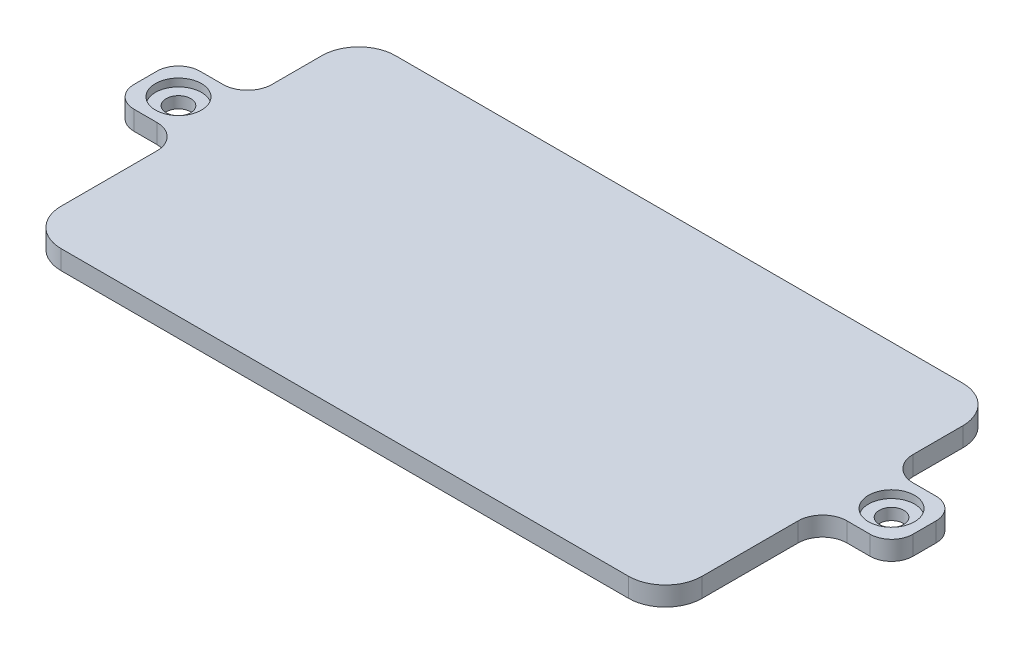
ISO-10303-21;
HEADER;
FILE_DESCRIPTION(('STEP AP214'),'2;1');
FILE_NAME('part.step','',(''),(''),'','','');
FILE_SCHEMA(('AUTOMOTIVE_DESIGN { 1 0 10303 214 1 1 1 1 }'));
ENDSEC;
DATA;
#1=APPLICATION_CONTEXT('core data for automotive mechanical design processes');
#2=APPLICATION_PROTOCOL_DEFINITION('international standard','automotive_design',2000,#1);
#3=PRODUCT_CONTEXT('',#1,'mechanical');
#4=PRODUCT('Part','Part','',(#3));
#5=PRODUCT_RELATED_PRODUCT_CATEGORY('part','',(#4));
#6=PRODUCT_DEFINITION_FORMATION('','',#4);
#7=PRODUCT_DEFINITION_CONTEXT('part definition',#1,'design');
#8=PRODUCT_DEFINITION('design','',#6,#7);
#9=PRODUCT_DEFINITION_SHAPE('','',#8);
#10=(LENGTH_UNIT() NAMED_UNIT(*) SI_UNIT(.MILLI.,.METRE.));
#11=(NAMED_UNIT(*) PLANE_ANGLE_UNIT() SI_UNIT($,.RADIAN.));
#12=(NAMED_UNIT(*) SI_UNIT($,.STERADIAN.) SOLID_ANGLE_UNIT());
#13=UNCERTAINTY_MEASURE_WITH_UNIT(LENGTH_MEASURE(1.E-05),#10,'distance_accuracy_value','');
#14=(GEOMETRIC_REPRESENTATION_CONTEXT(3) GLOBAL_UNCERTAINTY_ASSIGNED_CONTEXT((#13)) GLOBAL_UNIT_ASSIGNED_CONTEXT((#10,
#11,#12)) REPRESENTATION_CONTEXT('',''));
#15=CARTESIAN_POINT('',(0.,0.,0.));
#16=DIRECTION('',(0.,0.,1.));
#17=DIRECTION('',(1.,0.,0.));
#18=AXIS2_PLACEMENT_3D('',#15,#16,#17);
#19=CARTESIAN_POINT('',(109.635435749424,0.,-25.));
#20=DIRECTION('',(0.,1.,0.));
#21=DIRECTION('',(0.,0.,1.));
#22=AXIS2_PLACEMENT_3D('',#19,#20,#21);
#23=CYLINDRICAL_SURFACE('',#22,1.59999999999999);
#24=CARTESIAN_POINT('',(109.635435749424,0.,-25.));
#25=DIRECTION('',(0.,1.,0.));
#26=DIRECTION('',(0.,0.,1.));
#27=AXIS2_PLACEMENT_3D('',#24,#25,#26);
#28=CIRCLE('',#27,1.59999999999999);
#29=CARTESIAN_POINT('',(109.635435749424,0.,-23.4));
#30=VERTEX_POINT('',#29);
#31=EDGE_CURVE('E340',#30,#30,#28,.T.);
#32=ORIENTED_EDGE('',*,*,#31,.F.);
#33=EDGE_LOOP('',(#32));
#34=FACE_BOUND('',#33,.T.);
#35=CARTESIAN_POINT('',(109.635435749424,1.5,-25.));
#36=DIRECTION('',(0.,1.,0.));
#37=DIRECTION('',(0.,0.,1.));
#38=AXIS2_PLACEMENT_3D('',#35,#36,#37);
#39=CIRCLE('',#38,1.59999999999999);
#40=CARTESIAN_POINT('',(109.635435749424,1.5,-23.4));
#41=VERTEX_POINT('',#40);
#42=EDGE_CURVE('E37',#41,#41,#39,.F.);
#43=ORIENTED_EDGE('',*,*,#42,.F.);
#44=EDGE_LOOP('',(#43));
#45=FACE_BOUND('',#44,.T.);
#46=ADVANCED_FACE('F33',(#34,#45),#23,.F.);
#47=CARTESIAN_POINT('',(16.6354357494244,0.,-25.));
#48=DIRECTION('',(0.,1.,0.));
#49=DIRECTION('',(0.,0.,1.));
#50=AXIS2_PLACEMENT_3D('',#47,#48,#49);
#51=CYLINDRICAL_SURFACE('',#50,1.6);
#52=CARTESIAN_POINT('',(16.6354357494244,0.,-25.));
#53=DIRECTION('',(0.,1.,0.));
#54=DIRECTION('',(0.,0.,1.));
#55=AXIS2_PLACEMENT_3D('',#52,#53,#54);
#56=CIRCLE('',#55,1.6);
#57=CARTESIAN_POINT('',(16.6354357494244,0.,-23.4));
#58=VERTEX_POINT('',#57);
#59=EDGE_CURVE('E232',#58,#58,#56,.T.);
#60=ORIENTED_EDGE('',*,*,#59,.F.);
#61=EDGE_LOOP('',(#60));
#62=FACE_BOUND('',#61,.T.);
#63=CARTESIAN_POINT('',(16.6354357494244,1.5,-25.));
#64=DIRECTION('',(0.,1.,0.));
#65=DIRECTION('',(0.,0.,1.));
#66=AXIS2_PLACEMENT_3D('',#63,#64,#65);
#67=CIRCLE('',#66,1.6);
#68=CARTESIAN_POINT('',(16.6354357494244,1.5,-23.4));
#69=VERTEX_POINT('',#68);
#70=EDGE_CURVE('E334',#69,#69,#67,.F.);
#71=ORIENTED_EDGE('',*,*,#70,.F.);
#72=EDGE_LOOP('',(#71));
#73=FACE_BOUND('',#72,.T.);
#74=ADVANCED_FACE('F426',(#62,#73),#51,.F.);
#75=CARTESIAN_POINT('',(26.1354357494244,2.5,-5.));
#76=DIRECTION('',(0.,-1.,0.));
#77=DIRECTION('',(0.,0.,-1.));
#78=AXIS2_PLACEMENT_3D('',#75,#76,#77);
#79=CYLINDRICAL_SURFACE('',#78,4.79999999999999);
#80=CARTESIAN_POINT('',(26.1354357494244,0.,-5.));
#81=DIRECTION('',(0.,1.,0.));
#82=DIRECTION('',(0.,0.,-1.));
#83=AXIS2_PLACEMENT_3D('',#80,#81,#82);
#84=CIRCLE('',#83,4.79999999999999);
#85=CARTESIAN_POINT('',(21.3354357494244,0.,-5.00000000000005));
#86=VERTEX_POINT('',#85);
#87=CARTESIAN_POINT('',(26.1354357494244,0.,-0.2));
#88=VERTEX_POINT('',#87);
#89=EDGE_CURVE('E228',#86,#88,#84,.T.);
#90=ORIENTED_EDGE('',*,*,#89,.T.);
#91=DIRECTION('',(0.,-1.,0.));
#92=VECTOR('',#91,1.);
#93=CARTESIAN_POINT('',(26.1354357494244,2.5,-0.2));
#94=LINE('',#93,#92);
#95=CARTESIAN_POINT('',(26.1354357494244,2.5,-0.2));
#96=VERTEX_POINT('',#95);
#97=EDGE_CURVE('E11',#96,#88,#94,.T.);
#98=ORIENTED_EDGE('',*,*,#97,.F.);
#99=CARTESIAN_POINT('',(26.1354357494244,2.5,-5.));
#100=DIRECTION('',(0.,1.,0.));
#101=DIRECTION('',(0.,0.,-1.));
#102=AXIS2_PLACEMENT_3D('',#99,#100,#101);
#103=CIRCLE('',#102,4.79999999999999);
#104=CARTESIAN_POINT('',(21.3354357494244,2.5,-5.00000000000005));
#105=VERTEX_POINT('',#104);
#106=EDGE_CURVE('E275',#105,#96,#103,.T.);
#107=ORIENTED_EDGE('',*,*,#106,.F.);
#108=DIRECTION('',(0.,-1.,0.));
#109=VECTOR('',#108,1.);
#110=CARTESIAN_POINT('',(21.3354357494244,2.5,-5.00000000000005));
#111=LINE('',#110,#109);
#112=EDGE_CURVE('E224',#105,#86,#111,.T.);
#113=ORIENTED_EDGE('',*,*,#112,.T.);
#114=EDGE_LOOP('',(#90,#98,#107,#113));
#115=FACE_BOUND('',#114,.T.);
#116=ADVANCED_FACE('F35',(#115),#79,.T.);
#117=CARTESIAN_POINT('',(26.1354357494244,2.5,-0.2));
#118=DIRECTION('',(0.,0.,-1.));
#119=DIRECTION('',(-1.,0.,0.));
#120=AXIS2_PLACEMENT_3D('',#117,#118,#119);
#121=PLANE('',#120);
#122=DIRECTION('',(1.,0.,0.));
#123=VECTOR('',#122,1.);
#124=CARTESIAN_POINT('',(26.1354357494244,0.,-0.2));
#125=LINE('',#124,#123);
#126=CARTESIAN_POINT('',(100.135435749424,0.,-0.2));
#127=VERTEX_POINT('',#126);
#128=EDGE_CURVE('E231',#88,#127,#125,.T.);
#129=ORIENTED_EDGE('',*,*,#128,.T.);
#130=DIRECTION('',(0.,-1.,0.));
#131=VECTOR('',#130,1.);
#132=CARTESIAN_POINT('',(100.135435749424,2.5,-0.2));
#133=LINE('',#132,#131);
#134=CARTESIAN_POINT('',(100.135435749424,2.5,-0.2));
#135=VERTEX_POINT('',#134);
#136=EDGE_CURVE('E43',#135,#127,#133,.T.);
#137=ORIENTED_EDGE('',*,*,#136,.F.);
#138=DIRECTION('',(1.,0.,0.));
#139=VECTOR('',#138,1.);
#140=CARTESIAN_POINT('',(26.1354357494244,2.5,-0.2));
#141=LINE('',#140,#139);
#142=EDGE_CURVE('E143',#96,#135,#141,.T.);
#143=ORIENTED_EDGE('',*,*,#142,.F.);
#144=ORIENTED_EDGE('',*,*,#97,.T.);
#145=EDGE_LOOP('',(#129,#137,#143,#144));
#146=FACE_BOUND('',#145,.T.);
#147=ADVANCED_FACE('F684',(#146),#121,.F.);
#148=CARTESIAN_POINT('',(100.135435749424,2.5,-5.));
#149=DIRECTION('',(0.,-1.,0.));
#150=DIRECTION('',(0.,0.,-1.));
#151=AXIS2_PLACEMENT_3D('',#148,#149,#150);
#152=CYLINDRICAL_SURFACE('',#151,4.8);
#153=CARTESIAN_POINT('',(100.135435749424,0.,-5.));
#154=DIRECTION('',(0.,1.,0.));
#155=DIRECTION('',(0.,0.,1.));
#156=AXIS2_PLACEMENT_3D('',#153,#154,#155);
#157=CIRCLE('',#156,4.8);
#158=CARTESIAN_POINT('',(104.935435749424,0.,-5.00000000000003));
#159=VERTEX_POINT('',#158);
#160=EDGE_CURVE('E234',#127,#159,#157,.T.);
#161=ORIENTED_EDGE('',*,*,#160,.T.);
#162=DIRECTION('',(0.,-1.,0.));
#163=VECTOR('',#162,1.);
#164=CARTESIAN_POINT('',(104.935435749424,2.5,-5.00000000000003));
#165=LINE('',#164,#163);
#166=CARTESIAN_POINT('',(104.935435749424,2.5,-5.00000000000003));
#167=VERTEX_POINT('',#166);
#168=EDGE_CURVE('E330',#167,#159,#165,.T.);
#169=ORIENTED_EDGE('',*,*,#168,.F.);
#170=CARTESIAN_POINT('',(100.135435749424,2.5,-5.));
#171=DIRECTION('',(0.,1.,0.));
#172=DIRECTION('',(0.,0.,1.));
#173=AXIS2_PLACEMENT_3D('',#170,#171,#172);
#174=CIRCLE('',#173,4.8);
#175=EDGE_CURVE('E361',#135,#167,#174,.T.);
#176=ORIENTED_EDGE('',*,*,#175,.F.);
#177=ORIENTED_EDGE('',*,*,#136,.T.);
#178=EDGE_LOOP('',(#161,#169,#176,#177));
#179=FACE_BOUND('',#178,.T.);
#180=ADVANCED_FACE('F675',(#179),#152,.T.);
#181=CARTESIAN_POINT('',(104.935435749424,2.5,-17.5));
#182=DIRECTION('',(-1.,0.,0.));
#183=DIRECTION('',(0.,0.,1.));
#184=AXIS2_PLACEMENT_3D('',#181,#182,#183);
#185=PLANE('',#184);
#186=DIRECTION('',(0.,0.,-1.));
#187=VECTOR('',#186,1.);
#188=CARTESIAN_POINT('',(104.935435749424,0.,-17.5));
#189=LINE('',#188,#187);
#190=CARTESIAN_POINT('',(104.935435749424,0.,-17.5));
#191=VERTEX_POINT('',#190);
#192=EDGE_CURVE('E236',#159,#191,#189,.T.);
#193=ORIENTED_EDGE('',*,*,#192,.T.);
#194=DIRECTION('',(0.,-1.,0.));
#195=VECTOR('',#194,1.);
#196=CARTESIAN_POINT('',(104.935435749424,2.5,-17.5));
#197=LINE('',#196,#195);
#198=CARTESIAN_POINT('',(104.935435749424,2.5,-17.5));
#199=VERTEX_POINT('',#198);
#200=EDGE_CURVE('E327',#199,#191,#197,.T.);
#201=ORIENTED_EDGE('',*,*,#200,.F.);
#202=DIRECTION('',(0.,0.,-1.));
#203=VECTOR('',#202,1.);
#204=CARTESIAN_POINT('',(104.935435749424,2.5,-17.5));
#205=LINE('',#204,#203);
#206=EDGE_CURVE('E363',#167,#199,#205,.T.);
#207=ORIENTED_EDGE('',*,*,#206,.F.);
#208=ORIENTED_EDGE('',*,*,#168,.T.);
#209=EDGE_LOOP('',(#193,#201,#207,#208));
#210=FACE_BOUND('',#209,.T.);
#211=ADVANCED_FACE('F666',(#210),#185,.F.);
#212=CARTESIAN_POINT('',(108.135435749424,2.5,-17.5));
#213=DIRECTION('',(0.,-1.,0.));
#214=DIRECTION('',(0.,0.,-1.));
#215=AXIS2_PLACEMENT_3D('',#212,#213,#214);
#216=CYLINDRICAL_SURFACE('',#215,3.20000000000001);
#217=CARTESIAN_POINT('',(108.135435749424,0.,-17.5));
#218=DIRECTION('',(0.,-1.,0.));
#219=DIRECTION('',(0.,0.,1.));
#220=AXIS2_PLACEMENT_3D('',#217,#218,#219);
#221=CIRCLE('',#220,3.20000000000001);
#222=CARTESIAN_POINT('',(108.135435749424,0.,-20.7));
#223=VERTEX_POINT('',#222);
#224=EDGE_CURVE('E238',#191,#223,#221,.T.);
#225=ORIENTED_EDGE('',*,*,#224,.T.);
#226=DIRECTION('',(0.,-1.,0.));
#227=VECTOR('',#226,1.);
#228=CARTESIAN_POINT('',(108.135435749424,2.5,-20.7));
#229=LINE('',#228,#227);
#230=CARTESIAN_POINT('',(108.135435749424,2.5,-20.7));
#231=VERTEX_POINT('',#230);
#232=EDGE_CURVE('E324',#231,#223,#229,.T.);
#233=ORIENTED_EDGE('',*,*,#232,.F.);
#234=CARTESIAN_POINT('',(108.135435749424,2.5,-17.5));
#235=DIRECTION('',(0.,-1.,0.));
#236=DIRECTION('',(0.,0.,1.));
#237=AXIS2_PLACEMENT_3D('',#234,#235,#236);
#238=CIRCLE('',#237,3.20000000000001);
#239=EDGE_CURVE('E365',#199,#231,#238,.T.);
#240=ORIENTED_EDGE('',*,*,#239,.F.);
#241=ORIENTED_EDGE('',*,*,#200,.T.);
#242=EDGE_LOOP('',(#225,#233,#240,#241));
#243=FACE_BOUND('',#242,.T.);
#244=ADVANCED_FACE('F657',(#243),#216,.F.);
#245=CARTESIAN_POINT('',(111.135435749424,2.5,-20.7));
#246=DIRECTION('',(0.,0.,-1.));
#247=DIRECTION('',(-1.,0.,0.));
#248=AXIS2_PLACEMENT_3D('',#245,#246,#247);
#249=PLANE('',#248);
#250=DIRECTION('',(1.,0.,0.));
#251=VECTOR('',#250,1.);
#252=CARTESIAN_POINT('',(111.135435749424,0.,-20.7));
#253=LINE('',#252,#251);
#254=CARTESIAN_POINT('',(111.135435749424,0.,-20.7));
#255=VERTEX_POINT('',#254);
#256=EDGE_CURVE('E240',#223,#255,#253,.T.);
#257=ORIENTED_EDGE('',*,*,#256,.T.);
#258=DIRECTION('',(0.,-1.,0.));
#259=VECTOR('',#258,1.);
#260=CARTESIAN_POINT('',(111.135435749424,2.5,-20.7));
#261=LINE('',#260,#259);
#262=CARTESIAN_POINT('',(111.135435749424,2.5,-20.7));
#263=VERTEX_POINT('',#262);
#264=EDGE_CURVE('E321',#263,#255,#261,.T.);
#265=ORIENTED_EDGE('',*,*,#264,.F.);
#266=DIRECTION('',(1.,0.,0.));
#267=VECTOR('',#266,1.);
#268=CARTESIAN_POINT('',(111.135435749424,2.5,-20.7));
#269=LINE('',#268,#267);
#270=EDGE_CURVE('E367',#231,#263,#269,.T.);
#271=ORIENTED_EDGE('',*,*,#270,.F.);
#272=ORIENTED_EDGE('',*,*,#232,.T.);
#273=EDGE_LOOP('',(#257,#265,#271,#272));
#274=FACE_BOUND('',#273,.T.);
#275=ADVANCED_FACE('F648',(#274),#249,.F.);
#276=CARTESIAN_POINT('',(111.135435749424,2.5,-23.5));
#277=DIRECTION('',(0.,-1.,0.));
#278=DIRECTION('',(0.,0.,-1.));
#279=AXIS2_PLACEMENT_3D('',#276,#277,#278);
#280=CYLINDRICAL_SURFACE('',#279,2.8);
#281=CARTESIAN_POINT('',(111.135435749424,0.,-23.5));
#282=DIRECTION('',(0.,1.,0.));
#283=DIRECTION('',(0.,0.,-1.));
#284=AXIS2_PLACEMENT_3D('',#281,#282,#283);
#285=CIRCLE('',#284,2.8);
#286=CARTESIAN_POINT('',(113.935435749424,0.,-23.5));
#287=VERTEX_POINT('',#286);
#288=EDGE_CURVE('E242',#255,#287,#285,.T.);
#289=ORIENTED_EDGE('',*,*,#288,.T.);
#290=DIRECTION('',(0.,-1.,0.));
#291=VECTOR('',#290,1.);
#292=CARTESIAN_POINT('',(113.935435749424,2.5,-23.5));
#293=LINE('',#292,#291);
#294=CARTESIAN_POINT('',(113.935435749424,2.5,-23.5));
#295=VERTEX_POINT('',#294);
#296=EDGE_CURVE('E318',#295,#287,#293,.T.);
#297=ORIENTED_EDGE('',*,*,#296,.F.);
#298=CARTESIAN_POINT('',(111.135435749424,2.5,-23.5));
#299=DIRECTION('',(0.,1.,0.));
#300=DIRECTION('',(0.,0.,-1.));
#301=AXIS2_PLACEMENT_3D('',#298,#299,#300);
#302=CIRCLE('',#301,2.8);
#303=EDGE_CURVE('E369',#263,#295,#302,.T.);
#304=ORIENTED_EDGE('',*,*,#303,.F.);
#305=ORIENTED_EDGE('',*,*,#264,.T.);
#306=EDGE_LOOP('',(#289,#297,#304,#305));
#307=FACE_BOUND('',#306,.T.);
#308=ADVANCED_FACE('F639',(#307),#280,.T.);
#309=CARTESIAN_POINT('',(113.935435749424,2.5,-26.5));
#310=DIRECTION('',(-1.,0.,0.));
#311=DIRECTION('',(0.,0.,1.));
#312=AXIS2_PLACEMENT_3D('',#309,#310,#311);
#313=PLANE('',#312);
#314=DIRECTION('',(0.,0.,-1.));
#315=VECTOR('',#314,1.);
#316=CARTESIAN_POINT('',(113.935435749424,0.,-26.5));
#317=LINE('',#316,#315);
#318=CARTESIAN_POINT('',(113.935435749424,0.,-26.5));
#319=VERTEX_POINT('',#318);
#320=EDGE_CURVE('E244',#287,#319,#317,.T.);
#321=ORIENTED_EDGE('',*,*,#320,.T.);
#322=DIRECTION('',(0.,-1.,0.));
#323=VECTOR('',#322,1.);
#324=CARTESIAN_POINT('',(113.935435749424,2.5,-26.5));
#325=LINE('',#324,#323);
#326=CARTESIAN_POINT('',(113.935435749424,2.5,-26.5));
#327=VERTEX_POINT('',#326);
#328=EDGE_CURVE('E315',#327,#319,#325,.T.);
#329=ORIENTED_EDGE('',*,*,#328,.F.);
#330=DIRECTION('',(0.,0.,-1.));
#331=VECTOR('',#330,1.);
#332=CARTESIAN_POINT('',(113.935435749424,2.5,-26.5));
#333=LINE('',#332,#331);
#334=EDGE_CURVE('E371',#295,#327,#333,.T.);
#335=ORIENTED_EDGE('',*,*,#334,.F.);
#336=ORIENTED_EDGE('',*,*,#296,.T.);
#337=EDGE_LOOP('',(#321,#329,#335,#336));
#338=FACE_BOUND('',#337,.T.);
#339=ADVANCED_FACE('F630',(#338),#313,.F.);
#340=CARTESIAN_POINT('',(111.135435749424,2.5,-26.5));
#341=DIRECTION('',(0.,-1.,0.));
#342=DIRECTION('',(0.,0.,-1.));
#343=AXIS2_PLACEMENT_3D('',#340,#341,#342);
#344=CYLINDRICAL_SURFACE('',#343,2.8);
#345=CARTESIAN_POINT('',(111.135435749424,0.,-26.5));
#346=DIRECTION('',(0.,1.,0.));
#347=DIRECTION('',(0.,0.,-1.));
#348=AXIS2_PLACEMENT_3D('',#345,#346,#347);
#349=CIRCLE('',#348,2.8);
#350=CARTESIAN_POINT('',(111.135435749424,0.,-29.3));
#351=VERTEX_POINT('',#350);
#352=EDGE_CURVE('E246',#319,#351,#349,.T.);
#353=ORIENTED_EDGE('',*,*,#352,.T.);
#354=DIRECTION('',(0.,-1.,0.));
#355=VECTOR('',#354,1.);
#356=CARTESIAN_POINT('',(111.135435749424,2.5,-29.3));
#357=LINE('',#356,#355);
#358=CARTESIAN_POINT('',(111.135435749424,2.5,-29.3));
#359=VERTEX_POINT('',#358);
#360=EDGE_CURVE('E312',#359,#351,#357,.T.);
#361=ORIENTED_EDGE('',*,*,#360,.F.);
#362=CARTESIAN_POINT('',(111.135435749424,2.5,-26.5));
#363=DIRECTION('',(0.,1.,0.));
#364=DIRECTION('',(0.,0.,-1.));
#365=AXIS2_PLACEMENT_3D('',#362,#363,#364);
#366=CIRCLE('',#365,2.8);
#367=EDGE_CURVE('E373',#327,#359,#366,.T.);
#368=ORIENTED_EDGE('',*,*,#367,.F.);
#369=ORIENTED_EDGE('',*,*,#328,.T.);
#370=EDGE_LOOP('',(#353,#361,#368,#369));
#371=FACE_BOUND('',#370,.T.);
#372=ADVANCED_FACE('F621',(#371),#344,.T.);
#373=CARTESIAN_POINT('',(108.135435749424,2.5,-29.3));
#374=DIRECTION('',(0.,0.,1.));
#375=DIRECTION('',(1.,0.,0.));
#376=AXIS2_PLACEMENT_3D('',#373,#374,#375);
#377=PLANE('',#376);
#378=DIRECTION('',(-1.,0.,0.));
#379=VECTOR('',#378,1.);
#380=CARTESIAN_POINT('',(108.135435749424,0.,-29.3));
#381=LINE('',#380,#379);
#382=CARTESIAN_POINT('',(108.135435749424,0.,-29.3));
#383=VERTEX_POINT('',#382);
#384=EDGE_CURVE('E248',#351,#383,#381,.T.);
#385=ORIENTED_EDGE('',*,*,#384,.T.);
#386=DIRECTION('',(0.,-1.,0.));
#387=VECTOR('',#386,1.);
#388=CARTESIAN_POINT('',(108.135435749424,2.5,-29.3));
#389=LINE('',#388,#387);
#390=CARTESIAN_POINT('',(108.135435749424,2.5,-29.3));
#391=VERTEX_POINT('',#390);
#392=EDGE_CURVE('E309',#391,#383,#389,.T.);
#393=ORIENTED_EDGE('',*,*,#392,.F.);
#394=DIRECTION('',(-1.,0.,0.));
#395=VECTOR('',#394,1.);
#396=CARTESIAN_POINT('',(108.135435749424,2.5,-29.3));
#397=LINE('',#396,#395);
#398=EDGE_CURVE('E375',#359,#391,#397,.T.);
#399=ORIENTED_EDGE('',*,*,#398,.F.);
#400=ORIENTED_EDGE('',*,*,#360,.T.);
#401=EDGE_LOOP('',(#385,#393,#399,#400));
#402=FACE_BOUND('',#401,.T.);
#403=ADVANCED_FACE('F612',(#402),#377,.F.);
#404=CARTESIAN_POINT('',(108.135435749424,2.5,-32.5));
#405=DIRECTION('',(0.,-1.,0.));
#406=DIRECTION('',(0.,0.,-1.));
#407=AXIS2_PLACEMENT_3D('',#404,#405,#406);
#408=CYLINDRICAL_SURFACE('',#407,3.20000000000001);
#409=CARTESIAN_POINT('',(108.135435749424,0.,-32.5));
#410=DIRECTION('',(0.,-1.,0.));
#411=DIRECTION('',(0.,0.,1.));
#412=AXIS2_PLACEMENT_3D('',#409,#410,#411);
#413=CIRCLE('',#412,3.20000000000001);
#414=CARTESIAN_POINT('',(104.935435749424,0.,-32.5));
#415=VERTEX_POINT('',#414);
#416=EDGE_CURVE('E250',#383,#415,#413,.T.);
#417=ORIENTED_EDGE('',*,*,#416,.T.);
#418=DIRECTION('',(0.,-1.,0.));
#419=VECTOR('',#418,1.);
#420=CARTESIAN_POINT('',(104.935435749424,2.5,-32.5));
#421=LINE('',#420,#419);
#422=CARTESIAN_POINT('',(104.935435749424,2.5,-32.5));
#423=VERTEX_POINT('',#422);
#424=EDGE_CURVE('E306',#423,#415,#421,.T.);
#425=ORIENTED_EDGE('',*,*,#424,.F.);
#426=CARTESIAN_POINT('',(108.135435749424,2.5,-32.5));
#427=DIRECTION('',(0.,-1.,0.));
#428=DIRECTION('',(0.,0.,1.));
#429=AXIS2_PLACEMENT_3D('',#426,#427,#428);
#430=CIRCLE('',#429,3.20000000000001);
#431=EDGE_CURVE('E377',#391,#423,#430,.T.);
#432=ORIENTED_EDGE('',*,*,#431,.F.);
#433=ORIENTED_EDGE('',*,*,#392,.T.);
#434=EDGE_LOOP('',(#417,#425,#432,#433));
#435=FACE_BOUND('',#434,.T.);
#436=ADVANCED_FACE('F603',(#435),#408,.F.);
#437=CARTESIAN_POINT('',(104.935435749424,2.5,-39.));
#438=DIRECTION('',(-1.,0.,0.));
#439=DIRECTION('',(0.,0.,1.));
#440=AXIS2_PLACEMENT_3D('',#437,#438,#439);
#441=PLANE('',#440);
#442=DIRECTION('',(0.,0.,-1.));
#443=VECTOR('',#442,1.);
#444=CARTESIAN_POINT('',(104.935435749424,0.,-39.));
#445=LINE('',#444,#443);
#446=CARTESIAN_POINT('',(104.935435749424,0.,-39.));
#447=VERTEX_POINT('',#446);
#448=EDGE_CURVE('E252',#415,#447,#445,.T.);
#449=ORIENTED_EDGE('',*,*,#448,.T.);
#450=DIRECTION('',(0.,-1.,0.));
#451=VECTOR('',#450,1.);
#452=CARTESIAN_POINT('',(104.935435749424,2.5,-39.));
#453=LINE('',#452,#451);
#454=CARTESIAN_POINT('',(104.935435749424,2.5,-39.));
#455=VERTEX_POINT('',#454);
#456=EDGE_CURVE('E303',#455,#447,#453,.T.);
#457=ORIENTED_EDGE('',*,*,#456,.F.);
#458=DIRECTION('',(0.,0.,-1.));
#459=VECTOR('',#458,1.);
#460=CARTESIAN_POINT('',(104.935435749424,2.5,-39.));
#461=LINE('',#460,#459);
#462=EDGE_CURVE('E379',#423,#455,#461,.T.);
#463=ORIENTED_EDGE('',*,*,#462,.F.);
#464=ORIENTED_EDGE('',*,*,#424,.T.);
#465=EDGE_LOOP('',(#449,#457,#463,#464));
#466=FACE_BOUND('',#465,.T.);
#467=ADVANCED_FACE('F594',(#466),#441,.F.);
#468=CARTESIAN_POINT('',(100.135435749424,2.5,-39.));
#469=DIRECTION('',(0.,-1.,0.));
#470=DIRECTION('',(0.,0.,-1.));
#471=AXIS2_PLACEMENT_3D('',#468,#469,#470);
#472=CYLINDRICAL_SURFACE('',#471,4.8);
#473=CARTESIAN_POINT('',(100.135435749424,0.,-39.));
#474=DIRECTION('',(0.,1.,0.));
#475=DIRECTION('',(0.,0.,1.));
#476=AXIS2_PLACEMENT_3D('',#473,#474,#475);
#477=CIRCLE('',#476,4.8);
#478=CARTESIAN_POINT('',(100.135435749424,0.,-43.8));
#479=VERTEX_POINT('',#478);
#480=EDGE_CURVE('E254',#447,#479,#477,.T.);
#481=ORIENTED_EDGE('',*,*,#480,.T.);
#482=DIRECTION('',(0.,-1.,0.));
#483=VECTOR('',#482,1.);
#484=CARTESIAN_POINT('',(100.135435749424,2.5,-43.8));
#485=LINE('',#484,#483);
#486=CARTESIAN_POINT('',(100.135435749424,2.5,-43.8));
#487=VERTEX_POINT('',#486);
#488=EDGE_CURVE('E300',#487,#479,#485,.T.);
#489=ORIENTED_EDGE('',*,*,#488,.F.);
#490=CARTESIAN_POINT('',(100.135435749424,2.5,-39.));
#491=DIRECTION('',(0.,1.,0.));
#492=DIRECTION('',(0.,0.,1.));
#493=AXIS2_PLACEMENT_3D('',#490,#491,#492);
#494=CIRCLE('',#493,4.8);
#495=EDGE_CURVE('E381',#455,#487,#494,.T.);
#496=ORIENTED_EDGE('',*,*,#495,.F.);
#497=ORIENTED_EDGE('',*,*,#456,.T.);
#498=EDGE_LOOP('',(#481,#489,#496,#497));
#499=FACE_BOUND('',#498,.T.);
#500=ADVANCED_FACE('F585',(#499),#472,.T.);
#501=CARTESIAN_POINT('',(100.135435749424,2.5,-43.8));
#502=DIRECTION('',(0.,0.,1.));
#503=DIRECTION('',(1.,0.,0.));
#504=AXIS2_PLACEMENT_3D('',#501,#502,#503);
#505=PLANE('',#504);
#506=DIRECTION('',(-1.,0.,0.));
#507=VECTOR('',#506,1.);
#508=CARTESIAN_POINT('',(100.135435749424,0.,-43.8));
#509=LINE('',#508,#507);
#510=CARTESIAN_POINT('',(26.1354357494244,0.,-43.8));
#511=VERTEX_POINT('',#510);
#512=EDGE_CURVE('E256',#479,#511,#509,.T.);
#513=ORIENTED_EDGE('',*,*,#512,.T.);
#514=DIRECTION('',(0.,-1.,0.));
#515=VECTOR('',#514,1.);
#516=CARTESIAN_POINT('',(26.1354357494244,2.5,-43.8));
#517=LINE('',#516,#515);
#518=CARTESIAN_POINT('',(26.1354357494244,2.5,-43.8));
#519=VERTEX_POINT('',#518);
#520=EDGE_CURVE('E297',#519,#511,#517,.T.);
#521=ORIENTED_EDGE('',*,*,#520,.F.);
#522=DIRECTION('',(-1.,0.,0.));
#523=VECTOR('',#522,1.);
#524=CARTESIAN_POINT('',(100.135435749424,2.5,-43.8));
#525=LINE('',#524,#523);
#526=EDGE_CURVE('E383',#487,#519,#525,.T.);
#527=ORIENTED_EDGE('',*,*,#526,.F.);
#528=ORIENTED_EDGE('',*,*,#488,.T.);
#529=EDGE_LOOP('',(#513,#521,#527,#528));
#530=FACE_BOUND('',#529,.T.);
#531=ADVANCED_FACE('F576',(#530),#505,.F.);
#532=CARTESIAN_POINT('',(26.1354357494244,2.5,-39.));
#533=DIRECTION('',(0.,-1.,0.));
#534=DIRECTION('',(0.,0.,-1.));
#535=AXIS2_PLACEMENT_3D('',#532,#533,#534);
#536=CYLINDRICAL_SURFACE('',#535,4.8);
#537=CARTESIAN_POINT('',(26.1354357494244,0.,-39.));
#538=DIRECTION('',(0.,1.,0.));
#539=DIRECTION('',(0.,0.,1.));
#540=AXIS2_PLACEMENT_3D('',#537,#538,#539);
#541=CIRCLE('',#540,4.8);
#542=CARTESIAN_POINT('',(21.3354357494244,0.,-39.));
#543=VERTEX_POINT('',#542);
#544=EDGE_CURVE('E258',#511,#543,#541,.T.);
#545=ORIENTED_EDGE('',*,*,#544,.T.);
#546=DIRECTION('',(0.,-1.,0.));
#547=VECTOR('',#546,1.);
#548=CARTESIAN_POINT('',(21.3354357494244,2.5,-39.));
#549=LINE('',#548,#547);
#550=CARTESIAN_POINT('',(21.3354357494244,2.5,-39.));
#551=VERTEX_POINT('',#550);
#552=EDGE_CURVE('E294',#551,#543,#549,.T.);
#553=ORIENTED_EDGE('',*,*,#552,.F.);
#554=CARTESIAN_POINT('',(26.1354357494244,2.5,-39.));
#555=DIRECTION('',(0.,1.,0.));
#556=DIRECTION('',(0.,0.,1.));
#557=AXIS2_PLACEMENT_3D('',#554,#555,#556);
#558=CIRCLE('',#557,4.8);
#559=EDGE_CURVE('E385',#519,#551,#558,.T.);
#560=ORIENTED_EDGE('',*,*,#559,.F.);
#561=ORIENTED_EDGE('',*,*,#520,.T.);
#562=EDGE_LOOP('',(#545,#553,#560,#561));
#563=FACE_BOUND('',#562,.T.);
#564=ADVANCED_FACE('F567',(#563),#536,.T.);
#565=CARTESIAN_POINT('',(21.3354357494244,2.5,-39.));
#566=DIRECTION('',(1.,0.,0.));
#567=DIRECTION('',(0.,0.,-1.));
#568=AXIS2_PLACEMENT_3D('',#565,#566,#567);
#569=PLANE('',#568);
#570=DIRECTION('',(0.,0.,1.));
#571=VECTOR('',#570,1.);
#572=CARTESIAN_POINT('',(21.3354357494244,0.,-39.));
#573=LINE('',#572,#571);
#574=CARTESIAN_POINT('',(21.3354357494244,0.,-32.5));
#575=VERTEX_POINT('',#574);
#576=EDGE_CURVE('E260',#543,#575,#573,.T.);
#577=ORIENTED_EDGE('',*,*,#576,.T.);
#578=DIRECTION('',(0.,-1.,0.));
#579=VECTOR('',#578,1.);
#580=CARTESIAN_POINT('',(21.3354357494244,2.5,-32.5));
#581=LINE('',#580,#579);
#582=CARTESIAN_POINT('',(21.3354357494244,2.5,-32.5));
#583=VERTEX_POINT('',#582);
#584=EDGE_CURVE('E291',#583,#575,#581,.T.);
#585=ORIENTED_EDGE('',*,*,#584,.F.);
#586=DIRECTION('',(0.,0.,1.));
#587=VECTOR('',#586,1.);
#588=CARTESIAN_POINT('',(21.3354357494244,2.5,-39.));
#589=LINE('',#588,#587);
#590=EDGE_CURVE('E387',#551,#583,#589,.T.);
#591=ORIENTED_EDGE('',*,*,#590,.F.);
#592=ORIENTED_EDGE('',*,*,#552,.T.);
#593=EDGE_LOOP('',(#577,#585,#591,#592));
#594=FACE_BOUND('',#593,.T.);
#595=ADVANCED_FACE('F558',(#594),#569,.F.);
#596=CARTESIAN_POINT('',(18.1354357494244,2.5,-32.5));
#597=DIRECTION('',(0.,-1.,0.));
#598=DIRECTION('',(0.,0.,-1.));
#599=AXIS2_PLACEMENT_3D('',#596,#597,#598);
#600=CYLINDRICAL_SURFACE('',#599,3.19999999999999);
#601=CARTESIAN_POINT('',(18.1354357494244,0.,-32.5));
#602=DIRECTION('',(0.,-1.,0.));
#603=DIRECTION('',(0.,0.,1.));
#604=AXIS2_PLACEMENT_3D('',#601,#602,#603);
#605=CIRCLE('',#604,3.19999999999999);
#606=CARTESIAN_POINT('',(18.1354357494244,0.,-29.3));
#607=VERTEX_POINT('',#606);
#608=EDGE_CURVE('E262',#575,#607,#605,.T.);
#609=ORIENTED_EDGE('',*,*,#608,.T.);
#610=DIRECTION('',(0.,-1.,0.));
#611=VECTOR('',#610,1.);
#612=CARTESIAN_POINT('',(18.1354357494244,2.5,-29.3));
#613=LINE('',#612,#611);
#614=CARTESIAN_POINT('',(18.1354357494244,2.5,-29.3));
#615=VERTEX_POINT('',#614);
#616=EDGE_CURVE('E288',#615,#607,#613,.T.);
#617=ORIENTED_EDGE('',*,*,#616,.F.);
#618=CARTESIAN_POINT('',(18.1354357494244,2.5,-32.5));
#619=DIRECTION('',(0.,-1.,0.));
#620=DIRECTION('',(0.,0.,1.));
#621=AXIS2_PLACEMENT_3D('',#618,#619,#620);
#622=CIRCLE('',#621,3.19999999999999);
#623=EDGE_CURVE('E389',#583,#615,#622,.T.);
#624=ORIENTED_EDGE('',*,*,#623,.F.);
#625=ORIENTED_EDGE('',*,*,#584,.T.);
#626=EDGE_LOOP('',(#609,#617,#624,#625));
#627=FACE_BOUND('',#626,.T.);
#628=ADVANCED_FACE('F549',(#627),#600,.F.);
#629=CARTESIAN_POINT('',(18.1354357494244,2.5,-29.3));
#630=DIRECTION('',(0.,0.,1.));
#631=DIRECTION('',(1.,0.,0.));
#632=AXIS2_PLACEMENT_3D('',#629,#630,#631);
#633=PLANE('',#632);
#634=DIRECTION('',(-1.,0.,0.));
#635=VECTOR('',#634,1.);
#636=CARTESIAN_POINT('',(18.1354357494244,0.,-29.3));
#637=LINE('',#636,#635);
#638=CARTESIAN_POINT('',(15.1354357494244,0.,-29.3));
#639=VERTEX_POINT('',#638);
#640=EDGE_CURVE('E264',#607,#639,#637,.T.);
#641=ORIENTED_EDGE('',*,*,#640,.T.);
#642=DIRECTION('',(0.,-1.,0.));
#643=VECTOR('',#642,1.);
#644=CARTESIAN_POINT('',(15.1354357494244,2.5,-29.3));
#645=LINE('',#644,#643);
#646=CARTESIAN_POINT('',(15.1354357494244,2.5,-29.3));
#647=VERTEX_POINT('',#646);
#648=EDGE_CURVE('E285',#647,#639,#645,.T.);
#649=ORIENTED_EDGE('',*,*,#648,.F.);
#650=DIRECTION('',(-1.,0.,0.));
#651=VECTOR('',#650,1.);
#652=CARTESIAN_POINT('',(18.1354357494244,2.5,-29.3));
#653=LINE('',#652,#651);
#654=EDGE_CURVE('E391',#615,#647,#653,.T.);
#655=ORIENTED_EDGE('',*,*,#654,.F.);
#656=ORIENTED_EDGE('',*,*,#616,.T.);
#657=EDGE_LOOP('',(#641,#649,#655,#656));
#658=FACE_BOUND('',#657,.T.);
#659=ADVANCED_FACE('F540',(#658),#633,.F.);
#660=CARTESIAN_POINT('',(15.1354357494244,2.5,-26.5));
#661=DIRECTION('',(0.,-1.,0.));
#662=DIRECTION('',(0.,0.,-1.));
#663=AXIS2_PLACEMENT_3D('',#660,#661,#662);
#664=CYLINDRICAL_SURFACE('',#663,2.8);
#665=CARTESIAN_POINT('',(15.1354357494244,0.,-26.5));
#666=DIRECTION('',(0.,1.,0.));
#667=DIRECTION('',(0.,0.,-1.));
#668=AXIS2_PLACEMENT_3D('',#665,#666,#667);
#669=CIRCLE('',#668,2.8);
#670=CARTESIAN_POINT('',(12.3354357494244,0.,-26.5));
#671=VERTEX_POINT('',#670);
#672=EDGE_CURVE('E266',#639,#671,#669,.T.);
#673=ORIENTED_EDGE('',*,*,#672,.T.);
#674=DIRECTION('',(0.,-1.,0.));
#675=VECTOR('',#674,1.);
#676=CARTESIAN_POINT('',(12.3354357494244,2.5,-26.5));
#677=LINE('',#676,#675);
#678=CARTESIAN_POINT('',(12.3354357494244,2.5,-26.5));
#679=VERTEX_POINT('',#678);
#680=EDGE_CURVE('E282',#679,#671,#677,.T.);
#681=ORIENTED_EDGE('',*,*,#680,.F.);
#682=CARTESIAN_POINT('',(15.1354357494244,2.5,-26.5));
#683=DIRECTION('',(0.,1.,0.));
#684=DIRECTION('',(0.,0.,-1.));
#685=AXIS2_PLACEMENT_3D('',#682,#683,#684);
#686=CIRCLE('',#685,2.8);
#687=EDGE_CURVE('E393',#647,#679,#686,.T.);
#688=ORIENTED_EDGE('',*,*,#687,.F.);
#689=ORIENTED_EDGE('',*,*,#648,.T.);
#690=EDGE_LOOP('',(#673,#681,#688,#689));
#691=FACE_BOUND('',#690,.T.);
#692=ADVANCED_FACE('F532',(#691),#664,.T.);
#693=CARTESIAN_POINT('',(12.3354357494244,2.5,-26.5));
#694=DIRECTION('',(1.,0.,0.));
#695=DIRECTION('',(0.,0.,-1.));
#696=AXIS2_PLACEMENT_3D('',#693,#694,#695);
#697=PLANE('',#696);
#698=DIRECTION('',(0.,0.,1.));
#699=VECTOR('',#698,1.);
#700=CARTESIAN_POINT('',(12.3354357494244,0.,-26.5));
#701=LINE('',#700,#699);
#702=CARTESIAN_POINT('',(12.3354357494244,0.,-23.5));
#703=VERTEX_POINT('',#702);
#704=EDGE_CURVE('E268',#671,#703,#701,.T.);
#705=ORIENTED_EDGE('',*,*,#704,.T.);
#706=DIRECTION('',(0.,-1.,0.));
#707=VECTOR('',#706,1.);
#708=CARTESIAN_POINT('',(12.3354357494244,2.5,-23.5));
#709=LINE('',#708,#707);
#710=CARTESIAN_POINT('',(12.3354357494244,2.5,-23.5));
#711=VERTEX_POINT('',#710);
#712=EDGE_CURVE('E279',#711,#703,#709,.T.);
#713=ORIENTED_EDGE('',*,*,#712,.F.);
#714=DIRECTION('',(0.,0.,1.));
#715=VECTOR('',#714,1.);
#716=CARTESIAN_POINT('',(12.3354357494244,2.5,-26.5));
#717=LINE('',#716,#715);
#718=EDGE_CURVE('E395',#679,#711,#717,.T.);
#719=ORIENTED_EDGE('',*,*,#718,.F.);
#720=ORIENTED_EDGE('',*,*,#680,.T.);
#721=EDGE_LOOP('',(#705,#713,#719,#720));
#722=FACE_BOUND('',#721,.T.);
#723=ADVANCED_FACE('F401',(#722),#697,.F.);
#724=CARTESIAN_POINT('',(15.1354357494244,2.5,-23.5));
#725=DIRECTION('',(0.,-1.,0.));
#726=DIRECTION('',(0.,0.,-1.));
#727=AXIS2_PLACEMENT_3D('',#724,#725,#726);
#728=CYLINDRICAL_SURFACE('',#727,2.8);
#729=CARTESIAN_POINT('',(15.1354357494244,0.,-23.5));
#730=DIRECTION('',(0.,1.,0.));
#731=DIRECTION('',(0.,0.,-1.));
#732=AXIS2_PLACEMENT_3D('',#729,#730,#731);
#733=CIRCLE('',#732,2.8);
#734=CARTESIAN_POINT('',(15.1354357494244,0.,-20.7));
#735=VERTEX_POINT('',#734);
#736=EDGE_CURVE('E270',#703,#735,#733,.T.);
#737=ORIENTED_EDGE('',*,*,#736,.T.);
#738=DIRECTION('',(0.,-1.,0.));
#739=VECTOR('',#738,1.);
#740=CARTESIAN_POINT('',(15.1354357494244,2.5,-20.7));
#741=LINE('',#740,#739);
#742=CARTESIAN_POINT('',(15.1354357494244,2.5,-20.7));
#743=VERTEX_POINT('',#742);
#744=EDGE_CURVE('E219',#743,#735,#741,.T.);
#745=ORIENTED_EDGE('',*,*,#744,.F.);
#746=CARTESIAN_POINT('',(15.1354357494244,2.5,-23.5));
#747=DIRECTION('',(0.,1.,0.));
#748=DIRECTION('',(0.,0.,-1.));
#749=AXIS2_PLACEMENT_3D('',#746,#747,#748);
#750=CIRCLE('',#749,2.8);
#751=EDGE_CURVE('E210',#711,#743,#750,.T.);
#752=ORIENTED_EDGE('',*,*,#751,.F.);
#753=ORIENTED_EDGE('',*,*,#712,.T.);
#754=EDGE_LOOP('',(#737,#745,#752,#753));
#755=FACE_BOUND('',#754,.T.);
#756=ADVANCED_FACE('F405',(#755),#728,.T.);
#757=CARTESIAN_POINT('',(15.1354357494244,2.5,-20.7));
#758=DIRECTION('',(0.,0.,-1.));
#759=DIRECTION('',(-1.,0.,0.));
#760=AXIS2_PLACEMENT_3D('',#757,#758,#759);
#761=PLANE('',#760);
#762=DIRECTION('',(1.,0.,0.));
#763=VECTOR('',#762,1.);
#764=CARTESIAN_POINT('',(15.1354357494244,0.,-20.7));
#765=LINE('',#764,#763);
#766=CARTESIAN_POINT('',(18.1354357494244,0.,-20.7));
#767=VERTEX_POINT('',#766);
#768=EDGE_CURVE('E218',#735,#767,#765,.T.);
#769=ORIENTED_EDGE('',*,*,#768,.T.);
#770=DIRECTION('',(0.,-1.,0.));
#771=VECTOR('',#770,1.);
#772=CARTESIAN_POINT('',(18.1354357494244,2.5,-20.7));
#773=LINE('',#772,#771);
#774=CARTESIAN_POINT('',(18.1354357494244,2.5,-20.7));
#775=VERTEX_POINT('',#774);
#776=EDGE_CURVE('E215',#775,#767,#773,.T.);
#777=ORIENTED_EDGE('',*,*,#776,.F.);
#778=DIRECTION('',(1.,0.,0.));
#779=VECTOR('',#778,1.);
#780=CARTESIAN_POINT('',(15.1354357494244,2.5,-20.7));
#781=LINE('',#780,#779);
#782=EDGE_CURVE('E204',#743,#775,#781,.T.);
#783=ORIENTED_EDGE('',*,*,#782,.F.);
#784=ORIENTED_EDGE('',*,*,#744,.T.);
#785=EDGE_LOOP('',(#769,#777,#783,#784));
#786=FACE_BOUND('',#785,.T.);
#787=ADVANCED_FACE('F216',(#786),#761,.F.);
#788=CARTESIAN_POINT('',(18.1354357494244,2.5,-17.5));
#789=DIRECTION('',(0.,-1.,0.));
#790=DIRECTION('',(0.,0.,-1.));
#791=AXIS2_PLACEMENT_3D('',#788,#789,#790);
#792=CYLINDRICAL_SURFACE('',#791,3.2);
#793=CARTESIAN_POINT('',(18.1354357494244,0.,-17.5));
#794=DIRECTION('',(0.,-1.,0.));
#795=DIRECTION('',(0.,0.,-1.));
#796=AXIS2_PLACEMENT_3D('',#793,#794,#795);
#797=CIRCLE('',#796,3.2);
#798=CARTESIAN_POINT('',(21.3354357494244,0.,-17.5));
#799=VERTEX_POINT('',#798);
#800=EDGE_CURVE('E129',#767,#799,#797,.T.);
#801=ORIENTED_EDGE('',*,*,#800,.T.);
#802=DIRECTION('',(0.,-1.,0.));
#803=VECTOR('',#802,1.);
#804=CARTESIAN_POINT('',(21.3354357494244,2.5,-17.5));
#805=LINE('',#804,#803);
#806=CARTESIAN_POINT('',(21.3354357494244,2.5,-17.5));
#807=VERTEX_POINT('',#806);
#808=EDGE_CURVE('E220',#807,#799,#805,.T.);
#809=ORIENTED_EDGE('',*,*,#808,.F.);
#810=CARTESIAN_POINT('',(18.1354357494244,2.5,-17.5));
#811=DIRECTION('',(0.,-1.,0.));
#812=DIRECTION('',(0.,0.,-1.));
#813=AXIS2_PLACEMENT_3D('',#810,#811,#812);
#814=CIRCLE('',#813,3.2);
#815=EDGE_CURVE('E208',#775,#807,#814,.T.);
#816=ORIENTED_EDGE('',*,*,#815,.F.);
#817=ORIENTED_EDGE('',*,*,#776,.T.);
#818=EDGE_LOOP('',(#801,#809,#816,#817));
#819=FACE_BOUND('',#818,.T.);
#820=ADVANCED_FACE('F222',(#819),#792,.F.);
#821=CARTESIAN_POINT('',(21.3354357494244,2.5,-17.5));
#822=DIRECTION('',(1.,0.,0.));
#823=DIRECTION('',(0.,0.,-1.));
#824=AXIS2_PLACEMENT_3D('',#821,#822,#823);
#825=PLANE('',#824);
#826=DIRECTION('',(0.,0.,1.));
#827=VECTOR('',#826,1.);
#828=CARTESIAN_POINT('',(21.3354357494244,0.,-17.5));
#829=LINE('',#828,#827);
#830=EDGE_CURVE('E135',#799,#86,#829,.T.);
#831=ORIENTED_EDGE('',*,*,#830,.T.);
#832=ORIENTED_EDGE('',*,*,#112,.F.);
#833=DIRECTION('',(0.,0.,1.));
#834=VECTOR('',#833,1.);
#835=CARTESIAN_POINT('',(21.3354357494244,2.5,-17.5));
#836=LINE('',#835,#834);
#837=EDGE_CURVE('E52',#807,#105,#836,.T.);
#838=ORIENTED_EDGE('',*,*,#837,.F.);
#839=ORIENTED_EDGE('',*,*,#808,.T.);
#840=EDGE_LOOP('',(#831,#832,#838,#839));
#841=FACE_BOUND('',#840,.T.);
#842=ADVANCED_FACE('F413',(#841),#825,.F.);
#843=CARTESIAN_POINT('',(26.1354357494244,2.5,-5.));
#844=DIRECTION('',(0.,-1.,0.));
#845=DIRECTION('',(0.,0.,-1.));
#846=AXIS2_PLACEMENT_3D('',#843,#844,#845);
#847=PLANE('',#846);
#848=CARTESIAN_POINT('',(16.6354357494244,2.5,-25.));
#849=DIRECTION('',(0.,1.,0.));
#850=DIRECTION('',(0.,0.,1.));
#851=AXIS2_PLACEMENT_3D('',#848,#849,#850);
#852=CIRCLE('',#851,3.);
#853=CARTESIAN_POINT('',(16.6354357494244,2.5,-22.));
#854=VERTEX_POINT('',#853);
#855=EDGE_CURVE('E342',#854,#854,#852,.T.);
#856=ORIENTED_EDGE('',*,*,#855,.F.);
#857=EDGE_LOOP('',(#856));
#858=FACE_BOUND('',#857,.T.);
#859=CARTESIAN_POINT('',(109.635435749424,2.5,-25.));
#860=DIRECTION('',(0.,1.,0.));
#861=DIRECTION('',(0.,0.,1.));
#862=AXIS2_PLACEMENT_3D('',#859,#860,#861);
#863=CIRCLE('',#862,2.99999999999999);
#864=CARTESIAN_POINT('',(109.635435749424,2.5,-22.));
#865=VERTEX_POINT('',#864);
#866=EDGE_CURVE('E352',#865,#865,#863,.T.);
#867=ORIENTED_EDGE('',*,*,#866,.F.);
#868=EDGE_LOOP('',(#867));
#869=FACE_BOUND('',#868,.T.);
#870=ORIENTED_EDGE('',*,*,#106,.T.);
#871=ORIENTED_EDGE('',*,*,#142,.T.);
#872=ORIENTED_EDGE('',*,*,#175,.T.);
#873=ORIENTED_EDGE('',*,*,#206,.T.);
#874=ORIENTED_EDGE('',*,*,#239,.T.);
#875=ORIENTED_EDGE('',*,*,#270,.T.);
#876=ORIENTED_EDGE('',*,*,#303,.T.);
#877=ORIENTED_EDGE('',*,*,#334,.T.);
#878=ORIENTED_EDGE('',*,*,#367,.T.);
#879=ORIENTED_EDGE('',*,*,#398,.T.);
#880=ORIENTED_EDGE('',*,*,#431,.T.);
#881=ORIENTED_EDGE('',*,*,#462,.T.);
#882=ORIENTED_EDGE('',*,*,#495,.T.);
#883=ORIENTED_EDGE('',*,*,#526,.T.);
#884=ORIENTED_EDGE('',*,*,#559,.T.);
#885=ORIENTED_EDGE('',*,*,#590,.T.);
#886=ORIENTED_EDGE('',*,*,#623,.T.);
#887=ORIENTED_EDGE('',*,*,#654,.T.);
#888=ORIENTED_EDGE('',*,*,#687,.T.);
#889=ORIENTED_EDGE('',*,*,#718,.T.);
#890=ORIENTED_EDGE('',*,*,#751,.T.);
#891=ORIENTED_EDGE('',*,*,#782,.T.);
#892=ORIENTED_EDGE('',*,*,#815,.T.);
#893=ORIENTED_EDGE('',*,*,#837,.T.);
#894=EDGE_LOOP('',(#870,#871,#872,#873,#874,#875,#876,#877,#878,#879,#880,#881,#882,#883,#884,
#885,#886,#887,#888,#889,#890,#891,#892,#893));
#895=FACE_BOUND('',#894,.T.);
#896=ADVANCED_FACE('F206',(#858,#869,#895),#847,.F.);
#897=CARTESIAN_POINT('',(26.1354357494244,0.,-5.));
#898=DIRECTION('',(0.,-1.,0.));
#899=DIRECTION('',(0.,0.,-1.));
#900=AXIS2_PLACEMENT_3D('',#897,#898,#899);
#901=PLANE('',#900);
#902=ORIENTED_EDGE('',*,*,#59,.T.);
#903=EDGE_LOOP('',(#902));
#904=FACE_BOUND('',#903,.T.);
#905=ORIENTED_EDGE('',*,*,#31,.T.);
#906=EDGE_LOOP('',(#905));
#907=FACE_BOUND('',#906,.T.);
#908=ORIENTED_EDGE('',*,*,#89,.F.);
#909=ORIENTED_EDGE('',*,*,#830,.F.);
#910=ORIENTED_EDGE('',*,*,#800,.F.);
#911=ORIENTED_EDGE('',*,*,#768,.F.);
#912=ORIENTED_EDGE('',*,*,#736,.F.);
#913=ORIENTED_EDGE('',*,*,#704,.F.);
#914=ORIENTED_EDGE('',*,*,#672,.F.);
#915=ORIENTED_EDGE('',*,*,#640,.F.);
#916=ORIENTED_EDGE('',*,*,#608,.F.);
#917=ORIENTED_EDGE('',*,*,#576,.F.);
#918=ORIENTED_EDGE('',*,*,#544,.F.);
#919=ORIENTED_EDGE('',*,*,#512,.F.);
#920=ORIENTED_EDGE('',*,*,#480,.F.);
#921=ORIENTED_EDGE('',*,*,#448,.F.);
#922=ORIENTED_EDGE('',*,*,#416,.F.);
#923=ORIENTED_EDGE('',*,*,#384,.F.);
#924=ORIENTED_EDGE('',*,*,#352,.F.);
#925=ORIENTED_EDGE('',*,*,#320,.F.);
#926=ORIENTED_EDGE('',*,*,#288,.F.);
#927=ORIENTED_EDGE('',*,*,#256,.F.);
#928=ORIENTED_EDGE('',*,*,#224,.F.);
#929=ORIENTED_EDGE('',*,*,#192,.F.);
#930=ORIENTED_EDGE('',*,*,#160,.F.);
#931=ORIENTED_EDGE('',*,*,#128,.F.);
#932=EDGE_LOOP('',(#908,#909,#910,#911,#912,#913,#914,#915,#916,#917,#918,#919,#920,#921,#922,
#923,#924,#925,#926,#927,#928,#929,#930,#931));
#933=FACE_BOUND('',#932,.T.);
#934=ADVANCED_FACE('F408',(#904,#907,#933),#901,.T.);
#935=CARTESIAN_POINT('',(16.6354357494244,1.5,-25.));
#936=DIRECTION('',(0.,1.,0.));
#937=DIRECTION('',(0.,0.,1.));
#938=AXIS2_PLACEMENT_3D('',#935,#936,#937);
#939=PLANE('',#938);
#940=CARTESIAN_POINT('',(16.6354357494244,1.5,-25.));
#941=DIRECTION('',(0.,1.,0.));
#942=DIRECTION('',(0.,0.,1.));
#943=AXIS2_PLACEMENT_3D('',#940,#941,#942);
#944=CIRCLE('',#943,3.);
#945=CARTESIAN_POINT('',(16.6354357494244,1.5,-22.));
#946=VERTEX_POINT('',#945);
#947=EDGE_CURVE('E336',#946,#946,#944,.T.);
#948=ORIENTED_EDGE('',*,*,#947,.T.);
#949=EDGE_LOOP('',(#948));
#950=FACE_BOUND('',#949,.T.);
#951=ORIENTED_EDGE('',*,*,#70,.T.);
#952=EDGE_LOOP('',(#951));
#953=FACE_BOUND('',#952,.T.);
#954=ADVANCED_FACE('F439',(#950,#953),#939,.T.);
#955=CARTESIAN_POINT('',(16.6354357494244,1.5,-25.));
#956=DIRECTION('',(0.,1.,0.));
#957=DIRECTION('',(0.,0.,1.));
#958=AXIS2_PLACEMENT_3D('',#955,#956,#957);
#959=CYLINDRICAL_SURFACE('',#958,3.);
#960=ORIENTED_EDGE('',*,*,#947,.F.);
#961=EDGE_LOOP('',(#960));
#962=FACE_BOUND('',#961,.T.);
#963=ORIENTED_EDGE('',*,*,#855,.T.);
#964=EDGE_LOOP('',(#963));
#965=FACE_BOUND('',#964,.T.);
#966=ADVANCED_FACE('F444',(#962,#965),#959,.F.);
#967=CARTESIAN_POINT('',(109.635435749424,1.5,-25.));
#968=DIRECTION('',(0.,1.,0.));
#969=DIRECTION('',(0.,0.,1.));
#970=AXIS2_PLACEMENT_3D('',#967,#968,#969);
#971=PLANE('',#970);
#972=CARTESIAN_POINT('',(109.635435749424,1.5,-25.));
#973=DIRECTION('',(0.,1.,0.));
#974=DIRECTION('',(0.,0.,1.));
#975=AXIS2_PLACEMENT_3D('',#972,#973,#974);
#976=CIRCLE('',#975,2.99999999999999);
#977=CARTESIAN_POINT('',(109.635435749424,1.5,-22.));
#978=VERTEX_POINT('',#977);
#979=EDGE_CURVE('E347',#978,#978,#976,.T.);
#980=ORIENTED_EDGE('',*,*,#979,.T.);
#981=EDGE_LOOP('',(#980));
#982=FACE_BOUND('',#981,.T.);
#983=ORIENTED_EDGE('',*,*,#42,.T.);
#984=EDGE_LOOP('',(#983));
#985=FACE_BOUND('',#984,.T.);
#986=ADVANCED_FACE('F453',(#982,#985),#971,.T.);
#987=CARTESIAN_POINT('',(109.635435749424,1.5,-25.));
#988=DIRECTION('',(0.,1.,0.));
#989=DIRECTION('',(0.,0.,1.));
#990=AXIS2_PLACEMENT_3D('',#987,#988,#989);
#991=CYLINDRICAL_SURFACE('',#990,2.99999999999999);
#992=ORIENTED_EDGE('',*,*,#979,.F.);
#993=EDGE_LOOP('',(#992));
#994=FACE_BOUND('',#993,.T.);
#995=ORIENTED_EDGE('',*,*,#866,.T.);
#996=EDGE_LOOP('',(#995));
#997=FACE_BOUND('',#996,.T.);
#998=ADVANCED_FACE('F458',(#994,#997),#991,.F.);
#999=CLOSED_SHELL('',(#46,#74,#116,#147,#180,#211,#244,#275,#308,#339,#372,#403,#436,#467,#500,
#531,#564,#595,#628,#659,#692,#723,#756,#787,#820,#842,#896,#934,#954,#966,#986,#998));
#1000=MANIFOLD_SOLID_BREP('B2',#999);
#1001=ADVANCED_BREP_SHAPE_REPRESENTATION('',(#18,#1000),#14);
#1002=SHAPE_DEFINITION_REPRESENTATION(#9,#1001);
ENDSEC;
END-ISO-10303-21;
